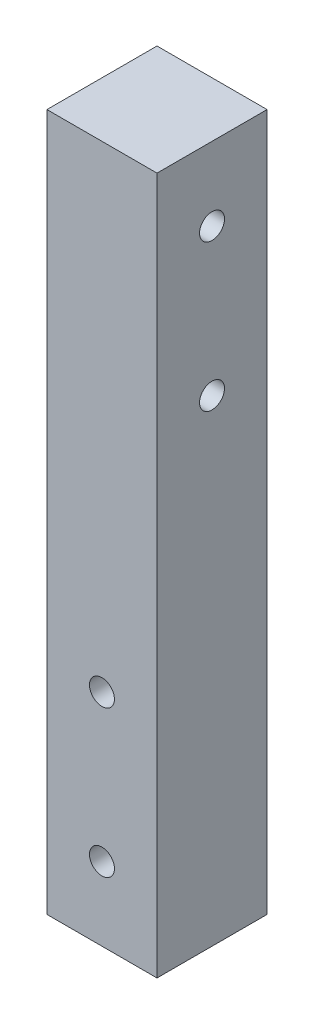
ISO-10303-21;
HEADER;
FILE_DESCRIPTION(('STEP AP214'),'2;1');
FILE_NAME('part.step','',(''),(''),'','','');
FILE_SCHEMA(('AUTOMOTIVE_DESIGN { 1 0 10303 214 1 1 1 1 }'));
ENDSEC;
DATA;
#1=APPLICATION_CONTEXT('core data for automotive mechanical design processes');
#2=APPLICATION_PROTOCOL_DEFINITION('international standard','automotive_design',2000,#1);
#3=PRODUCT_CONTEXT('',#1,'mechanical');
#4=PRODUCT('Part','Part','',(#3));
#5=PRODUCT_RELATED_PRODUCT_CATEGORY('part','',(#4));
#6=PRODUCT_DEFINITION_FORMATION('','',#4);
#7=PRODUCT_DEFINITION_CONTEXT('part definition',#1,'design');
#8=PRODUCT_DEFINITION('design','',#6,#7);
#9=PRODUCT_DEFINITION_SHAPE('','',#8);
#10=(LENGTH_UNIT() NAMED_UNIT(*) SI_UNIT(.MILLI.,.METRE.));
#11=(NAMED_UNIT(*) PLANE_ANGLE_UNIT() SI_UNIT($,.RADIAN.));
#12=(NAMED_UNIT(*) SI_UNIT($,.STERADIAN.) SOLID_ANGLE_UNIT());
#13=UNCERTAINTY_MEASURE_WITH_UNIT(LENGTH_MEASURE(1.E-05),#10,'distance_accuracy_value','');
#14=(GEOMETRIC_REPRESENTATION_CONTEXT(3) GLOBAL_UNCERTAINTY_ASSIGNED_CONTEXT((#13)) GLOBAL_UNIT_ASSIGNED_CONTEXT((#10,
#11,#12)) REPRESENTATION_CONTEXT('',''));
#15=CARTESIAN_POINT('',(0.,0.,0.));
#16=DIRECTION('',(0.,0.,1.));
#17=DIRECTION('',(1.,0.,0.));
#18=AXIS2_PLACEMENT_3D('',#15,#16,#17);
#19=CARTESIAN_POINT('',(0.,95.,0.));
#20=DIRECTION('',(1.,0.,0.));
#21=DIRECTION('',(0.,0.,-1.));
#22=AXIS2_PLACEMENT_3D('',#19,#20,#21);
#23=PLANE('',#22);
#24=CARTESIAN_POINT('',(0.,85.,-7.49999999999999));
#25=DIRECTION('',(1.,0.,0.));
#26=DIRECTION('',(0.,0.,-1.));
#27=AXIS2_PLACEMENT_3D('',#24,#25,#26);
#28=CIRCLE('',#27,1.7);
#29=CARTESIAN_POINT('',(0.,85.,-9.19999999999999));
#30=VERTEX_POINT('',#29);
#31=EDGE_CURVE('E140',#30,#30,#28,.T.);
#32=ORIENTED_EDGE('',*,*,#31,.T.);
#33=EDGE_LOOP('',(#32));
#34=FACE_BOUND('',#33,.T.);
#35=CARTESIAN_POINT('',(0.,65.,-7.49999999999999));
#36=DIRECTION('',(1.,0.,0.));
#37=DIRECTION('',(0.,0.,-1.));
#38=AXIS2_PLACEMENT_3D('',#35,#36,#37);
#39=CIRCLE('',#38,1.7);
#40=CARTESIAN_POINT('',(0.,65.,-9.19999999999999));
#41=VERTEX_POINT('',#40);
#42=EDGE_CURVE('E147',#41,#41,#39,.T.);
#43=ORIENTED_EDGE('',*,*,#42,.T.);
#44=EDGE_LOOP('',(#43));
#45=FACE_BOUND('',#44,.T.);
#46=DIRECTION('',(0.,0.,1.));
#47=VECTOR('',#46,1.);
#48=CARTESIAN_POINT('',(0.,0.,0.));
#49=LINE('',#48,#47);
#50=CARTESIAN_POINT('',(0.,0.,-15.));
#51=VERTEX_POINT('',#50);
#52=CARTESIAN_POINT('',(0.,0.,0.));
#53=VERTEX_POINT('',#52);
#54=EDGE_CURVE('E114',#51,#53,#49,.T.);
#55=ORIENTED_EDGE('',*,*,#54,.T.);
#56=DIRECTION('',(0.,-1.,0.));
#57=VECTOR('',#56,1.);
#58=CARTESIAN_POINT('',(0.,95.,0.));
#59=LINE('',#58,#57);
#60=CARTESIAN_POINT('',(0.,95.,0.));
#61=VERTEX_POINT('',#60);
#62=EDGE_CURVE('E11',#61,#53,#59,.T.);
#63=ORIENTED_EDGE('',*,*,#62,.F.);
#64=DIRECTION('',(0.,0.,1.));
#65=VECTOR('',#64,1.);
#66=CARTESIAN_POINT('',(0.,95.,0.));
#67=LINE('',#66,#65);
#68=CARTESIAN_POINT('',(0.,95.,-15.));
#69=VERTEX_POINT('',#68);
#70=EDGE_CURVE('E100',#69,#61,#67,.T.);
#71=ORIENTED_EDGE('',*,*,#70,.F.);
#72=DIRECTION('',(0.,-1.,0.));
#73=VECTOR('',#72,1.);
#74=CARTESIAN_POINT('',(0.,95.,-15.));
#75=LINE('',#74,#73);
#76=EDGE_CURVE('E108',#69,#51,#75,.T.);
#77=ORIENTED_EDGE('',*,*,#76,.T.);
#78=EDGE_LOOP('',(#55,#63,#71,#77));
#79=FACE_BOUND('',#78,.T.);
#80=ADVANCED_FACE('F44',(#34,#45,#79),#23,.F.);
#81=CARTESIAN_POINT('',(0.,95.,0.));
#82=DIRECTION('',(0.,0.,-1.));
#83=DIRECTION('',(-1.,0.,0.));
#84=AXIS2_PLACEMENT_3D('',#81,#82,#83);
#85=PLANE('',#84);
#86=CARTESIAN_POINT('',(7.50000000000001,10.,0.));
#87=DIRECTION('',(0.,0.,1.));
#88=DIRECTION('',(1.,0.,0.));
#89=AXIS2_PLACEMENT_3D('',#86,#87,#88);
#90=CIRCLE('',#89,1.7);
#91=CARTESIAN_POINT('',(9.20000000000001,10.,0.));
#92=VERTEX_POINT('',#91);
#93=EDGE_CURVE('E141',#92,#92,#90,.T.);
#94=ORIENTED_EDGE('',*,*,#93,.F.);
#95=EDGE_LOOP('',(#94));
#96=FACE_BOUND('',#95,.T.);
#97=CARTESIAN_POINT('',(7.50000000000001,30.,0.));
#98=DIRECTION('',(0.,0.,1.));
#99=DIRECTION('',(1.,0.,0.));
#100=AXIS2_PLACEMENT_3D('',#97,#98,#99);
#101=CIRCLE('',#100,1.7);
#102=CARTESIAN_POINT('',(9.20000000000001,30.,0.));
#103=VERTEX_POINT('',#102);
#104=EDGE_CURVE('E137',#103,#103,#101,.T.);
#105=ORIENTED_EDGE('',*,*,#104,.F.);
#106=EDGE_LOOP('',(#105));
#107=FACE_BOUND('',#106,.T.);
#108=DIRECTION('',(1.,0.,0.));
#109=VECTOR('',#108,1.);
#110=CARTESIAN_POINT('',(0.,0.,0.));
#111=LINE('',#110,#109);
#112=CARTESIAN_POINT('',(15.,0.,0.));
#113=VERTEX_POINT('',#112);
#114=EDGE_CURVE('E105',#53,#113,#111,.T.);
#115=ORIENTED_EDGE('',*,*,#114,.T.);
#116=DIRECTION('',(0.,-1.,0.));
#117=VECTOR('',#116,1.);
#118=CARTESIAN_POINT('',(15.,95.,0.));
#119=LINE('',#118,#117);
#120=CARTESIAN_POINT('',(15.,95.,0.));
#121=VERTEX_POINT('',#120);
#122=EDGE_CURVE('E53',#121,#113,#119,.T.);
#123=ORIENTED_EDGE('',*,*,#122,.F.);
#124=DIRECTION('',(1.,0.,0.));
#125=VECTOR('',#124,1.);
#126=CARTESIAN_POINT('',(0.,95.,0.));
#127=LINE('',#126,#125);
#128=EDGE_CURVE('E95',#61,#121,#127,.T.);
#129=ORIENTED_EDGE('',*,*,#128,.F.);
#130=ORIENTED_EDGE('',*,*,#62,.T.);
#131=EDGE_LOOP('',(#115,#123,#129,#130));
#132=FACE_BOUND('',#131,.T.);
#133=ADVANCED_FACE('F101',(#96,#107,#132),#85,.F.);
#134=CARTESIAN_POINT('',(15.,95.,0.));
#135=DIRECTION('',(-1.,0.,0.));
#136=DIRECTION('',(0.,0.,1.));
#137=AXIS2_PLACEMENT_3D('',#134,#135,#136);
#138=PLANE('',#137);
#139=CARTESIAN_POINT('',(15.,85.,-7.49999999999999));
#140=DIRECTION('',(1.,0.,0.));
#141=DIRECTION('',(0.,0.,-1.));
#142=AXIS2_PLACEMENT_3D('',#139,#140,#141);
#143=CIRCLE('',#142,1.7);
#144=CARTESIAN_POINT('',(15.,85.,-9.19999999999999));
#145=VERTEX_POINT('',#144);
#146=EDGE_CURVE('E158',#145,#145,#143,.T.);
#147=ORIENTED_EDGE('',*,*,#146,.F.);
#148=EDGE_LOOP('',(#147));
#149=FACE_BOUND('',#148,.T.);
#150=CARTESIAN_POINT('',(15.,65.,-7.49999999999999));
#151=DIRECTION('',(1.,0.,0.));
#152=DIRECTION('',(0.,0.,-1.));
#153=AXIS2_PLACEMENT_3D('',#150,#151,#152);
#154=CIRCLE('',#153,1.7);
#155=CARTESIAN_POINT('',(15.,65.,-9.19999999999999));
#156=VERTEX_POINT('',#155);
#157=EDGE_CURVE('E152',#156,#156,#154,.T.);
#158=ORIENTED_EDGE('',*,*,#157,.F.);
#159=EDGE_LOOP('',(#158));
#160=FACE_BOUND('',#159,.T.);
#161=DIRECTION('',(0.,0.,-1.));
#162=VECTOR('',#161,1.);
#163=CARTESIAN_POINT('',(15.,0.,0.));
#164=LINE('',#163,#162);
#165=CARTESIAN_POINT('',(15.,0.,-15.));
#166=VERTEX_POINT('',#165);
#167=EDGE_CURVE('E78',#113,#166,#164,.T.);
#168=ORIENTED_EDGE('',*,*,#167,.T.);
#169=DIRECTION('',(0.,-1.,0.));
#170=VECTOR('',#169,1.);
#171=CARTESIAN_POINT('',(15.,95.,-15.));
#172=LINE('',#171,#170);
#173=CARTESIAN_POINT('',(15.,95.,-15.));
#174=VERTEX_POINT('',#173);
#175=EDGE_CURVE('E102',#174,#166,#172,.T.);
#176=ORIENTED_EDGE('',*,*,#175,.F.);
#177=DIRECTION('',(0.,0.,-1.));
#178=VECTOR('',#177,1.);
#179=CARTESIAN_POINT('',(15.,95.,0.));
#180=LINE('',#179,#178);
#181=EDGE_CURVE('E92',#121,#174,#180,.T.);
#182=ORIENTED_EDGE('',*,*,#181,.F.);
#183=ORIENTED_EDGE('',*,*,#122,.T.);
#184=EDGE_LOOP('',(#168,#176,#182,#183));
#185=FACE_BOUND('',#184,.T.);
#186=ADVANCED_FACE('F104',(#149,#160,#185),#138,.F.);
#187=CARTESIAN_POINT('',(0.,95.,-15.));
#188=DIRECTION('',(0.,0.,1.));
#189=DIRECTION('',(1.,0.,0.));
#190=AXIS2_PLACEMENT_3D('',#187,#188,#189);
#191=PLANE('',#190);
#192=CARTESIAN_POINT('',(7.50000000000001,10.,-15.));
#193=DIRECTION('',(0.,0.,1.));
#194=DIRECTION('',(1.,0.,0.));
#195=AXIS2_PLACEMENT_3D('',#192,#193,#194);
#196=CIRCLE('',#195,1.7);
#197=CARTESIAN_POINT('',(9.20000000000001,10.,-15.));
#198=VERTEX_POINT('',#197);
#199=EDGE_CURVE('E117',#198,#198,#196,.T.);
#200=ORIENTED_EDGE('',*,*,#199,.T.);
#201=EDGE_LOOP('',(#200));
#202=FACE_BOUND('',#201,.T.);
#203=CARTESIAN_POINT('',(7.50000000000001,30.,-15.));
#204=DIRECTION('',(0.,0.,1.));
#205=DIRECTION('',(1.,0.,0.));
#206=AXIS2_PLACEMENT_3D('',#203,#204,#205);
#207=CIRCLE('',#206,1.7);
#208=CARTESIAN_POINT('',(9.20000000000001,30.,-15.));
#209=VERTEX_POINT('',#208);
#210=EDGE_CURVE('E133',#209,#209,#207,.T.);
#211=ORIENTED_EDGE('',*,*,#210,.T.);
#212=EDGE_LOOP('',(#211));
#213=FACE_BOUND('',#212,.T.);
#214=DIRECTION('',(-1.,0.,0.));
#215=VECTOR('',#214,1.);
#216=CARTESIAN_POINT('',(0.,0.,-15.));
#217=LINE('',#216,#215);
#218=EDGE_CURVE('E81',#166,#51,#217,.T.);
#219=ORIENTED_EDGE('',*,*,#218,.T.);
#220=ORIENTED_EDGE('',*,*,#76,.F.);
#221=DIRECTION('',(-1.,0.,0.));
#222=VECTOR('',#221,1.);
#223=CARTESIAN_POINT('',(0.,95.,-15.));
#224=LINE('',#223,#222);
#225=EDGE_CURVE('E62',#174,#69,#224,.T.);
#226=ORIENTED_EDGE('',*,*,#225,.F.);
#227=ORIENTED_EDGE('',*,*,#175,.T.);
#228=EDGE_LOOP('',(#219,#220,#226,#227));
#229=FACE_BOUND('',#228,.T.);
#230=ADVANCED_FACE('F130',(#202,#213,#229),#191,.F.);
#231=CARTESIAN_POINT('',(0.,95.,0.));
#232=DIRECTION('',(0.,-1.,0.));
#233=DIRECTION('',(0.,0.,-1.));
#234=AXIS2_PLACEMENT_3D('',#231,#232,#233);
#235=PLANE('',#234);
#236=ORIENTED_EDGE('',*,*,#70,.T.);
#237=ORIENTED_EDGE('',*,*,#128,.T.);
#238=ORIENTED_EDGE('',*,*,#181,.T.);
#239=ORIENTED_EDGE('',*,*,#225,.T.);
#240=EDGE_LOOP('',(#236,#237,#238,#239));
#241=FACE_BOUND('',#240,.T.);
#242=ADVANCED_FACE('F91',(#241),#235,.F.);
#243=CARTESIAN_POINT('',(0.,0.,0.));
#244=DIRECTION('',(0.,-1.,0.));
#245=DIRECTION('',(0.,0.,-1.));
#246=AXIS2_PLACEMENT_3D('',#243,#244,#245);
#247=PLANE('',#246);
#248=ORIENTED_EDGE('',*,*,#54,.F.);
#249=ORIENTED_EDGE('',*,*,#218,.F.);
#250=ORIENTED_EDGE('',*,*,#167,.F.);
#251=ORIENTED_EDGE('',*,*,#114,.F.);
#252=EDGE_LOOP('',(#248,#249,#250,#251));
#253=FACE_BOUND('',#252,.T.);
#254=ADVANCED_FACE('F128',(#253),#247,.T.);
#255=CARTESIAN_POINT('',(7.50000000000001,30.,-15.));
#256=DIRECTION('',(0.,0.,1.));
#257=DIRECTION('',(1.,0.,0.));
#258=AXIS2_PLACEMENT_3D('',#255,#256,#257);
#259=CYLINDRICAL_SURFACE('',#258,1.7);
#260=ORIENTED_EDGE('',*,*,#210,.F.);
#261=EDGE_LOOP('',(#260));
#262=FACE_BOUND('',#261,.T.);
#263=ORIENTED_EDGE('',*,*,#104,.T.);
#264=EDGE_LOOP('',(#263));
#265=FACE_BOUND('',#264,.T.);
#266=ADVANCED_FACE('F187',(#262,#265),#259,.F.);
#267=CARTESIAN_POINT('',(7.50000000000001,10.,-15.));
#268=DIRECTION('',(0.,0.,1.));
#269=DIRECTION('',(1.,0.,0.));
#270=AXIS2_PLACEMENT_3D('',#267,#268,#269);
#271=CYLINDRICAL_SURFACE('',#270,1.7);
#272=ORIENTED_EDGE('',*,*,#199,.F.);
#273=EDGE_LOOP('',(#272));
#274=FACE_BOUND('',#273,.T.);
#275=ORIENTED_EDGE('',*,*,#93,.T.);
#276=EDGE_LOOP('',(#275));
#277=FACE_BOUND('',#276,.T.);
#278=ADVANCED_FACE('F182',(#274,#277),#271,.F.);
#279=CARTESIAN_POINT('',(0.,65.,-7.49999999999999));
#280=DIRECTION('',(1.,0.,0.));
#281=DIRECTION('',(0.,0.,-1.));
#282=AXIS2_PLACEMENT_3D('',#279,#280,#281);
#283=CYLINDRICAL_SURFACE('',#282,1.7);
#284=ORIENTED_EDGE('',*,*,#42,.F.);
#285=EDGE_LOOP('',(#284));
#286=FACE_BOUND('',#285,.T.);
#287=ORIENTED_EDGE('',*,*,#157,.T.);
#288=EDGE_LOOP('',(#287));
#289=FACE_BOUND('',#288,.T.);
#290=ADVANCED_FACE('F171',(#286,#289),#283,.F.);
#291=CARTESIAN_POINT('',(0.,85.,-7.49999999999999));
#292=DIRECTION('',(1.,0.,0.));
#293=DIRECTION('',(0.,0.,-1.));
#294=AXIS2_PLACEMENT_3D('',#291,#292,#293);
#295=CYLINDRICAL_SURFACE('',#294,1.7);
#296=ORIENTED_EDGE('',*,*,#31,.F.);
#297=EDGE_LOOP('',(#296));
#298=FACE_BOUND('',#297,.T.);
#299=ORIENTED_EDGE('',*,*,#146,.T.);
#300=EDGE_LOOP('',(#299));
#301=FACE_BOUND('',#300,.T.);
#302=ADVANCED_FACE('F169',(#298,#301),#295,.F.);
#303=CLOSED_SHELL('',(#80,#133,#186,#230,#242,#254,#266,#278,#290,#302));
#304=MANIFOLD_SOLID_BREP('B2',#303);
#305=ADVANCED_BREP_SHAPE_REPRESENTATION('',(#18,#304),#14);
#306=SHAPE_DEFINITION_REPRESENTATION(#9,#305);
ENDSEC;
END-ISO-10303-21;
